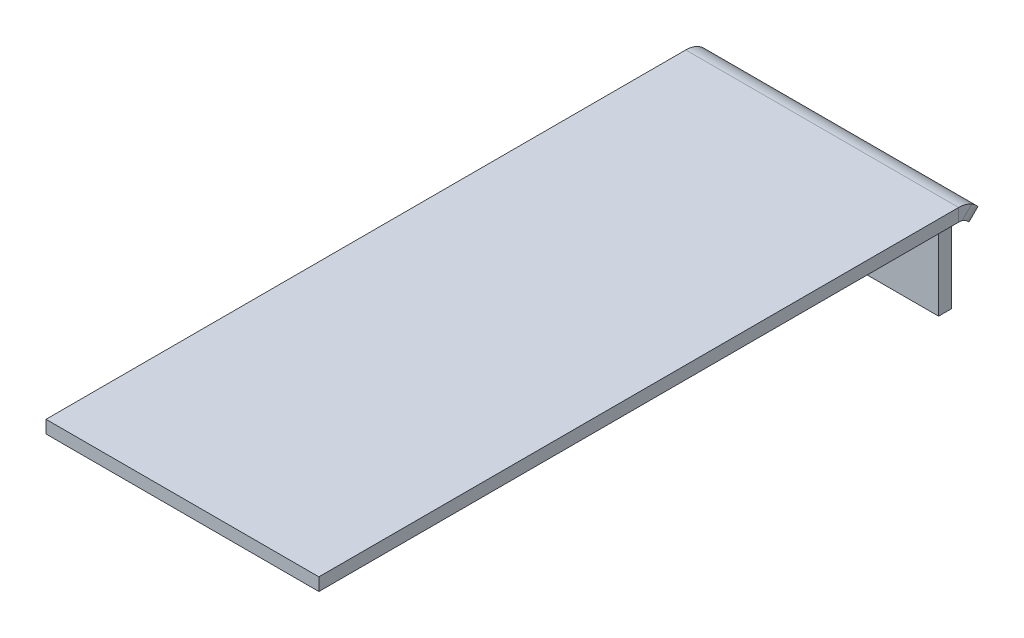
ISO-10303-21;
HEADER;
FILE_DESCRIPTION(('STEP AP214'),'2;1');
FILE_NAME('part.step','',(''),(''),'','','');
FILE_SCHEMA(('AUTOMOTIVE_DESIGN { 1 0 10303 214 1 1 1 1 }'));
ENDSEC;
DATA;
#1=APPLICATION_CONTEXT('core data for automotive mechanical design processes');
#2=APPLICATION_PROTOCOL_DEFINITION('international standard','automotive_design',2000,#1);
#3=PRODUCT_CONTEXT('',#1,'mechanical');
#4=PRODUCT('Part','Part','',(#3));
#5=PRODUCT_RELATED_PRODUCT_CATEGORY('part','',(#4));
#6=PRODUCT_DEFINITION_FORMATION('','',#4);
#7=PRODUCT_DEFINITION_CONTEXT('part definition',#1,'design');
#8=PRODUCT_DEFINITION('design','',#6,#7);
#9=PRODUCT_DEFINITION_SHAPE('','',#8);
#10=(LENGTH_UNIT() NAMED_UNIT(*) SI_UNIT(.MILLI.,.METRE.));
#11=(NAMED_UNIT(*) PLANE_ANGLE_UNIT() SI_UNIT($,.RADIAN.));
#12=(NAMED_UNIT(*) SI_UNIT($,.STERADIAN.) SOLID_ANGLE_UNIT());
#13=UNCERTAINTY_MEASURE_WITH_UNIT(LENGTH_MEASURE(1.E-05),#10,'distance_accuracy_value','');
#14=(GEOMETRIC_REPRESENTATION_CONTEXT(3) GLOBAL_UNCERTAINTY_ASSIGNED_CONTEXT((#13)) GLOBAL_UNIT_ASSIGNED_CONTEXT((#10,
#11,#12)) REPRESENTATION_CONTEXT('',''));
#15=CARTESIAN_POINT('',(0.,0.,0.));
#16=DIRECTION('',(0.,0.,1.));
#17=DIRECTION('',(1.,0.,0.));
#18=AXIS2_PLACEMENT_3D('',#15,#16,#17);
#19=CARTESIAN_POINT('',(53.5,-40.,-35.0000000000001));
#20=DIRECTION('',(0.,0.,-1.));
#21=DIRECTION('',(0.,1.,0.));
#22=AXIS2_PLACEMENT_3D('',#19,#20,#21);
#23=PLANE('',#22);
#24=DIRECTION('',(0.,-1.,0.));
#25=VECTOR('',#24,1.);
#26=CARTESIAN_POINT('',(-53.5,-40.,-35.0000000000001));
#27=LINE('',#26,#25);
#28=CARTESIAN_POINT('',(-53.5,-44.1421356237309,-35.0000000000001));
#29=VERTEX_POINT('',#28);
#30=CARTESIAN_POINT('',(-53.5,-72.,-35.0000000000001));
#31=VERTEX_POINT('',#30);
#32=EDGE_CURVE('E362',#29,#31,#27,.T.);
#33=ORIENTED_EDGE('',*,*,#32,.T.);
#34=DIRECTION('',(0.707106781186549,-0.707106781186546,0.));
#35=VECTOR('',#34,1.);
#36=CARTESIAN_POINT('',(-53.5,-72.,-35.0000000000001));
#37=LINE('',#36,#35);
#38=CARTESIAN_POINT('',(-45.4999999999999,-80.,-35.0000000000001));
#39=VERTEX_POINT('',#38);
#40=EDGE_CURVE('E60',#31,#39,#37,.T.);
#41=ORIENTED_EDGE('',*,*,#40,.T.);
#42=DIRECTION('',(-1.,0.,0.));
#43=VECTOR('',#42,1.);
#44=CARTESIAN_POINT('',(53.5,-80.,-35.0000000000001));
#45=LINE('',#44,#43);
#46=CARTESIAN_POINT('',(6.5,-80.,-35.0000000000001));
#47=VERTEX_POINT('',#46);
#48=EDGE_CURVE('E181',#47,#39,#45,.T.);
#49=ORIENTED_EDGE('',*,*,#48,.F.);
#50=DIRECTION('',(0.,1.,0.));
#51=VECTOR('',#50,1.);
#52=CARTESIAN_POINT('',(6.5,-40.,-35.0000000000001));
#53=LINE('',#52,#51);
#54=CARTESIAN_POINT('',(6.5,-44.142135623731,-35.0000000000001));
#55=VERTEX_POINT('',#54);
#56=EDGE_CURVE('E164',#47,#55,#53,.T.);
#57=ORIENTED_EDGE('',*,*,#56,.T.);
#58=DIRECTION('',(-1.,0.,0.));
#59=VECTOR('',#58,1.);
#60=CARTESIAN_POINT('',(53.5,-44.1421356237309,-35.0000000000001));
#61=LINE('',#60,#59);
#62=EDGE_CURVE('E305',#55,#29,#61,.T.);
#63=ORIENTED_EDGE('',*,*,#62,.T.);
#64=EDGE_LOOP('',(#33,#41,#49,#57,#63));
#65=FACE_BOUND('',#64,.T.);
#66=ADVANCED_FACE('F38',(#65),#23,.F.);
#67=CARTESIAN_POINT('',(53.5,-80.,-40.));
#68=DIRECTION('',(0.,-1.,0.));
#69=DIRECTION('',(0.,0.,-1.));
#70=AXIS2_PLACEMENT_3D('',#67,#68,#69);
#71=PLANE('',#70);
#72=ORIENTED_EDGE('',*,*,#48,.T.);
#73=DIRECTION('',(0.,0.,-1.));
#74=VECTOR('',#73,1.);
#75=CARTESIAN_POINT('',(-45.4999999999999,-80.,-40.));
#76=LINE('',#75,#74);
#77=CARTESIAN_POINT('',(-45.4999999999999,-80.,-40.));
#78=VERTEX_POINT('',#77);
#79=EDGE_CURVE('E46',#39,#78,#76,.T.);
#80=ORIENTED_EDGE('',*,*,#79,.T.);
#81=DIRECTION('',(-1.,0.,0.));
#82=VECTOR('',#81,1.);
#83=CARTESIAN_POINT('',(53.5,-80.,-40.));
#84=LINE('',#83,#82);
#85=CARTESIAN_POINT('',(6.5,-80.,-40.));
#86=VERTEX_POINT('',#85);
#87=EDGE_CURVE('E179',#86,#78,#84,.T.);
#88=ORIENTED_EDGE('',*,*,#87,.F.);
#89=DIRECTION('',(0.,0.,-1.));
#90=VECTOR('',#89,1.);
#91=CARTESIAN_POINT('',(6.5,-80.,-40.));
#92=LINE('',#91,#90);
#93=EDGE_CURVE('E156',#86,#47,#92,.F.);
#94=ORIENTED_EDGE('',*,*,#93,.T.);
#95=EDGE_LOOP('',(#72,#80,#88,#94));
#96=FACE_BOUND('',#95,.T.);
#97=ADVANCED_FACE('F267',(#96),#71,.T.);
#98=CARTESIAN_POINT('',(53.5,-40.,-40.));
#99=DIRECTION('',(0.,0.,-1.));
#100=DIRECTION('',(0.,1.,0.));
#101=AXIS2_PLACEMENT_3D('',#98,#99,#100);
#102=PLANE('',#101);
#103=ORIENTED_EDGE('',*,*,#87,.T.);
#104=DIRECTION('',(-0.707106781186549,0.707106781186546,0.));
#105=VECTOR('',#104,1.);
#106=CARTESIAN_POINT('',(-15.9999999999998,-109.5,-40.));
#107=LINE('',#106,#105);
#108=CARTESIAN_POINT('',(-53.5,-72.,-40.));
#109=VERTEX_POINT('',#108);
#110=EDGE_CURVE('E11',#78,#109,#107,.T.);
#111=ORIENTED_EDGE('',*,*,#110,.T.);
#112=DIRECTION('',(0.,-1.,0.));
#113=VECTOR('',#112,1.);
#114=CARTESIAN_POINT('',(-53.5,-40.,-40.));
#115=LINE('',#114,#113);
#116=CARTESIAN_POINT('',(-53.5,-44.1421356237309,-40.));
#117=VERTEX_POINT('',#116);
#118=EDGE_CURVE('E177',#117,#109,#115,.T.);
#119=ORIENTED_EDGE('',*,*,#118,.F.);
#120=DIRECTION('',(-1.,0.,0.));
#121=VECTOR('',#120,1.);
#122=CARTESIAN_POINT('',(53.5,-44.1421356237309,-40.));
#123=LINE('',#122,#121);
#124=CARTESIAN_POINT('',(6.5,-44.142135623731,-40.));
#125=VERTEX_POINT('',#124);
#126=EDGE_CURVE('E169',#125,#117,#123,.T.);
#127=ORIENTED_EDGE('',*,*,#126,.F.);
#128=DIRECTION('',(0.,1.,0.));
#129=VECTOR('',#128,1.);
#130=CARTESIAN_POINT('',(6.5,-80.,-40.));
#131=LINE('',#130,#129);
#132=EDGE_CURVE('E159',#86,#125,#131,.T.);
#133=ORIENTED_EDGE('',*,*,#132,.F.);
#134=EDGE_LOOP('',(#103,#111,#119,#127,#133));
#135=FACE_BOUND('',#134,.T.);
#136=ADVANCED_FACE('F175',(#135),#102,.T.);
#137=CARTESIAN_POINT('',(53.5,-44.142135623731,-30.0000000000002));
#138=DIRECTION('',(-1.,0.,0.));
#139=DIRECTION('',(0.,0.,1.));
#140=AXIS2_PLACEMENT_3D('',#137,#138,#139);
#141=CYLINDRICAL_SURFACE('',#140,10.);
#142=DIRECTION('',(-1.,0.,0.));
#143=VECTOR('',#142,1.);
#144=CARTESIAN_POINT('',(53.5,-37.0710678118655,-37.0710678118655));
#145=LINE('',#144,#143);
#146=CARTESIAN_POINT('',(6.5,-37.0710678118655,-37.0710678118655));
#147=VERTEX_POINT('',#146);
#148=CARTESIAN_POINT('',(-53.5,-37.0710678118655,-37.0710678118655));
#149=VERTEX_POINT('',#148);
#150=EDGE_CURVE('E171',#147,#149,#145,.T.);
#151=ORIENTED_EDGE('',*,*,#150,.F.);
#152=CARTESIAN_POINT('',(6.5,-44.142135623731,-30.0000000000002));
#153=DIRECTION('',(-1.,0.,0.));
#154=DIRECTION('',(0.,0.,1.));
#155=AXIS2_PLACEMENT_3D('',#152,#153,#154);
#156=CIRCLE('',#155,10.);
#157=EDGE_CURVE('E149',#125,#147,#156,.F.);
#158=ORIENTED_EDGE('',*,*,#157,.F.);
#159=ORIENTED_EDGE('',*,*,#126,.T.);
#160=CARTESIAN_POINT('',(-53.5,-44.142135623731,-30.0000000000002));
#161=DIRECTION('',(1.,0.,0.));
#162=DIRECTION('',(0.,0.,-1.));
#163=AXIS2_PLACEMENT_3D('',#160,#161,#162);
#164=CIRCLE('',#163,10.);
#165=EDGE_CURVE('E359',#149,#117,#164,.F.);
#166=ORIENTED_EDGE('',*,*,#165,.F.);
#167=EDGE_LOOP('',(#151,#158,#159,#166));
#168=FACE_BOUND('',#167,.T.);
#169=ADVANCED_FACE('F167',(#168),#141,.T.);
#170=CARTESIAN_POINT('',(53.5,0.,0.));
#171=DIRECTION('',(0.,0.707106781186548,-0.707106781186547));
#172=DIRECTION('',(0.,0.707106781186547,0.707106781186548));
#173=AXIS2_PLACEMENT_3D('',#170,#171,#172);
#174=PLANE('',#173);
#175=DIRECTION('',(-1.,0.,0.));
#176=VECTOR('',#175,1.);
#177=CARTESIAN_POINT('',(53.5,-2.92893218813452,-2.9289321881345));
#178=LINE('',#177,#176);
#179=CARTESIAN_POINT('',(53.2000735899034,-2.92893218813452,-2.9289321881345));
#180=VERTEX_POINT('',#179);
#181=CARTESIAN_POINT('',(-53.5,-2.92893218813452,-2.9289321881345));
#182=VERTEX_POINT('',#181);
#183=EDGE_CURVE('E183',#180,#182,#178,.T.);
#184=ORIENTED_EDGE('',*,*,#183,.F.);
#185=CARTESIAN_POINT('',(43.5,-1.21012848345235,-1.2101284834527));
#186=DIRECTION('',(0.,0.707106781186548,-0.707106781186547));
#187=DIRECTION('',(0.,0.707106781186547,0.707106781186548));
#188=AXIS2_PLACEMENT_3D('',#185,#186,#187);
#189=CIRCLE('',#188,10.);
#190=CARTESIAN_POINT('',(46.4703454373142,-7.96205591134384,-7.96205591134402));
#191=VERTEX_POINT('',#190);
#192=EDGE_CURVE('E215',#180,#191,#189,.T.);
#193=ORIENTED_EDGE('',*,*,#192,.T.);
#194=CARTESIAN_POINT('',(64.2924180611995,-48.4736204786927,-48.4736204786929));
#195=DIRECTION('',(0.,0.707106781186548,-0.707106781186547));
#196=DIRECTION('',(0.,0.707106781186547,0.707106781186548));
#197=AXIS2_PLACEMENT_3D('',#194,#195,#196);
#198=CIRCLE('',#197,60.);
#199=EDGE_CURVE('E200',#191,#147,#198,.F.);
#200=ORIENTED_EDGE('',*,*,#199,.T.);
#201=ORIENTED_EDGE('',*,*,#150,.T.);
#202=DIRECTION('',(0.,-0.707106781186547,-0.707106781186548));
#203=VECTOR('',#202,1.);
#204=CARTESIAN_POINT('',(-53.5,0.,0.));
#205=LINE('',#204,#203);
#206=EDGE_CURVE('E321',#182,#149,#205,.T.);
#207=ORIENTED_EDGE('',*,*,#206,.F.);
#208=EDGE_LOOP('',(#184,#193,#200,#201,#207));
#209=FACE_BOUND('',#208,.T.);
#210=ADVANCED_FACE('F318',(#209),#174,.T.);
#211=CARTESIAN_POINT('',(53.5,-3.53553390593274,3.53553390593309));
#212=DIRECTION('',(0.,0.707106781186548,-0.707106781186547));
#213=DIRECTION('',(0.,0.707106781186547,0.707106781186548));
#214=AXIS2_PLACEMENT_3D('',#211,#212,#213);
#215=PLANE('',#214);
#216=CARTESIAN_POINT('',(64.2924180611995,-52.0091543846255,-44.9380865727598));
#217=DIRECTION('',(0.,0.707106781186548,-0.707106781186547));
#218=DIRECTION('',(0.,0.707106781186547,0.707106781186548));
#219=AXIS2_PLACEMENT_3D('',#216,#217,#218);
#220=CIRCLE('',#219,60.);
#221=CARTESIAN_POINT('',(6.5,-40.6066017177982,-33.5355339059324));
#222=VERTEX_POINT('',#221);
#223=CARTESIAN_POINT('',(46.4703454373142,-11.4975898172766,-4.42652200541094));
#224=VERTEX_POINT('',#223);
#225=EDGE_CURVE('E202',#222,#224,#220,.T.);
#226=ORIENTED_EDGE('',*,*,#225,.T.);
#227=CARTESIAN_POINT('',(43.5,-4.74566238938509,2.32540542248039));
#228=DIRECTION('',(0.,0.707106781186548,-0.707106781186547));
#229=DIRECTION('',(0.,0.707106781186547,0.707106781186548));
#230=AXIS2_PLACEMENT_3D('',#227,#228,#229);
#231=CIRCLE('',#230,10.);
#232=CARTESIAN_POINT('',(53.2000735899034,-6.46446609406726,0.606601717798583));
#233=VERTEX_POINT('',#232);
#234=EDGE_CURVE('E239',#224,#233,#231,.F.);
#235=ORIENTED_EDGE('',*,*,#234,.T.);
#236=DIRECTION('',(-1.,0.,0.));
#237=VECTOR('',#236,1.);
#238=CARTESIAN_POINT('',(53.5,-6.46446609406726,0.606601717798583));
#239=LINE('',#238,#237);
#240=CARTESIAN_POINT('',(-53.5,-6.46446609406726,0.606601717798583));
#241=VERTEX_POINT('',#240);
#242=EDGE_CURVE('E333',#233,#241,#239,.T.);
#243=ORIENTED_EDGE('',*,*,#242,.T.);
#244=DIRECTION('',(0.,-0.707106781186547,-0.707106781186548));
#245=VECTOR('',#244,1.);
#246=CARTESIAN_POINT('',(-53.5,-3.53553390593274,3.53553390593309));
#247=LINE('',#246,#245);
#248=CARTESIAN_POINT('',(-53.5,-40.6066017177982,-33.5355339059324));
#249=VERTEX_POINT('',#248);
#250=EDGE_CURVE('E341',#241,#249,#247,.T.);
#251=ORIENTED_EDGE('',*,*,#250,.T.);
#252=DIRECTION('',(-1.,0.,0.));
#253=VECTOR('',#252,1.);
#254=CARTESIAN_POINT('',(53.5,-40.6066017177982,-33.5355339059324));
#255=LINE('',#254,#253);
#256=EDGE_CURVE('E335',#222,#249,#255,.T.);
#257=ORIENTED_EDGE('',*,*,#256,.F.);
#258=EDGE_LOOP('',(#226,#235,#243,#251,#257));
#259=FACE_BOUND('',#258,.T.);
#260=ADVANCED_FACE('F249',(#259),#215,.F.);
#261=CARTESIAN_POINT('',(53.5,-44.142135623731,-30.0000000000002));
#262=DIRECTION('',(-1.,0.,0.));
#263=DIRECTION('',(0.,0.,1.));
#264=AXIS2_PLACEMENT_3D('',#261,#262,#263);
#265=CYLINDRICAL_SURFACE('',#264,5.);
#266=CARTESIAN_POINT('',(6.5,-44.142135623731,-30.0000000000002));
#267=DIRECTION('',(-1.,0.,0.));
#268=DIRECTION('',(0.,0.,1.));
#269=AXIS2_PLACEMENT_3D('',#266,#267,#268);
#270=CIRCLE('',#269,5.);
#271=EDGE_CURVE('E152',#55,#222,#270,.F.);
#272=ORIENTED_EDGE('',*,*,#271,.T.);
#273=ORIENTED_EDGE('',*,*,#256,.T.);
#274=CARTESIAN_POINT('',(-53.5,-44.142135623731,-30.0000000000002));
#275=DIRECTION('',(1.,0.,0.));
#276=DIRECTION('',(0.,0.,-1.));
#277=AXIS2_PLACEMENT_3D('',#274,#275,#276);
#278=CIRCLE('',#277,5.);
#279=EDGE_CURVE('E338',#249,#29,#278,.F.);
#280=ORIENTED_EDGE('',*,*,#279,.T.);
#281=ORIENTED_EDGE('',*,*,#62,.F.);
#282=EDGE_LOOP('',(#272,#273,#280,#281));
#283=FACE_BOUND('',#282,.T.);
#284=ADVANCED_FACE('F291',(#283),#265,.F.);
#285=CARTESIAN_POINT('',(53.5,-2.92893218813452,-2.9289321881345));
#286=DIRECTION('',(1.,0.,0.));
#287=DIRECTION('',(0.,0.,-1.));
#288=AXIS2_PLACEMENT_3D('',#285,#286,#287);
#289=PLANE('',#288);
#290=CARTESIAN_POINT('',(53.5,-10.,4.14213562373078));
#291=DIRECTION('',(1.,0.,0.));
#292=DIRECTION('',(0.,0.,-1.));
#293=AXIS2_PLACEMENT_3D('',#290,#291,#292);
#294=CIRCLE('',#293,5.);
#295=CARTESIAN_POINT('',(53.5,-5.,4.14213562373078));
#296=VERTEX_POINT('',#295);
#297=CARTESIAN_POINT('',(53.5,-5.19158243194091,2.77132546503633));
#298=VERTEX_POINT('',#297);
#299=EDGE_CURVE('E299',#296,#298,#294,.F.);
#300=ORIENTED_EDGE('',*,*,#299,.T.);
#301=DIRECTION('',(0.,-0.707106781186548,0.707106781186547));
#302=VECTOR('',#301,1.);
#303=CARTESIAN_POINT('',(53.5,-1.21012848345235,-1.2101284834527));
#304=LINE('',#303,#302);
#305=CARTESIAN_POINT('',(53.5,-1.42220848188859,-0.998048485016056));
#306=VERTEX_POINT('',#305);
#307=EDGE_CURVE('E205',#298,#306,#304,.F.);
#308=ORIENTED_EDGE('',*,*,#307,.T.);
#309=CARTESIAN_POINT('',(53.5,-10.,4.14213562373078));
#310=DIRECTION('',(1.,0.,0.));
#311=DIRECTION('',(0.,0.,-1.));
#312=AXIS2_PLACEMENT_3D('',#309,#310,#311);
#313=CIRCLE('',#312,10.);
#314=CARTESIAN_POINT('',(53.5,0.,4.14213562373078));
#315=VERTEX_POINT('',#314);
#316=EDGE_CURVE('E315',#315,#306,#313,.F.);
#317=ORIENTED_EDGE('',*,*,#316,.F.);
#318=DIRECTION('',(0.,1.,0.));
#319=VECTOR('',#318,1.);
#320=CARTESIAN_POINT('',(53.5,-5.,4.14213562373078));
#321=LINE('',#320,#319);
#322=EDGE_CURVE('E198',#296,#315,#321,.T.);
#323=ORIENTED_EDGE('',*,*,#322,.F.);
#324=EDGE_LOOP('',(#300,#308,#317,#323));
#325=FACE_BOUND('',#324,.T.);
#326=ADVANCED_FACE('F288',(#325),#289,.T.);
#327=CARTESIAN_POINT('',(-53.5,0.,4.14213562373078));
#328=DIRECTION('',(-1.,0.,0.));
#329=DIRECTION('',(0.,0.,1.));
#330=AXIS2_PLACEMENT_3D('',#327,#328,#329);
#331=PLANE('',#330);
#332=DIRECTION('',(0.,-1.,0.));
#333=VECTOR('',#332,1.);
#334=CARTESIAN_POINT('',(-53.5,0.,4.14213562373078));
#335=LINE('',#334,#333);
#336=CARTESIAN_POINT('',(-53.5,0.,4.14213562373078));
#337=VERTEX_POINT('',#336);
#338=CARTESIAN_POINT('',(-53.5,-5.,4.14213562373078));
#339=VERTEX_POINT('',#338);
#340=EDGE_CURVE('E196',#337,#339,#335,.T.);
#341=ORIENTED_EDGE('',*,*,#340,.F.);
#342=CARTESIAN_POINT('',(-53.5,-10.,4.14213562373078));
#343=DIRECTION('',(1.,0.,0.));
#344=DIRECTION('',(0.,0.,-1.));
#345=AXIS2_PLACEMENT_3D('',#342,#343,#344);
#346=CIRCLE('',#345,10.);
#347=EDGE_CURVE('E356',#337,#182,#346,.F.);
#348=ORIENTED_EDGE('',*,*,#347,.T.);
#349=DIRECTION('',(0.,0.707106781186548,-0.707106781186547));
#350=VECTOR('',#349,1.);
#351=CARTESIAN_POINT('',(-53.5,-6.46446609406726,0.606601717798583));
#352=LINE('',#351,#350);
#353=EDGE_CURVE('E193',#241,#182,#352,.T.);
#354=ORIENTED_EDGE('',*,*,#353,.F.);
#355=CARTESIAN_POINT('',(-53.5,-10.,4.14213562373078));
#356=DIRECTION('',(1.,0.,0.));
#357=DIRECTION('',(0.,0.,-1.));
#358=AXIS2_PLACEMENT_3D('',#355,#356,#357);
#359=CIRCLE('',#358,5.);
#360=EDGE_CURVE('E344',#339,#241,#359,.F.);
#361=ORIENTED_EDGE('',*,*,#360,.F.);
#362=EDGE_LOOP('',(#341,#348,#354,#361));
#363=FACE_BOUND('',#362,.T.);
#364=ADVANCED_FACE('F285',(#363),#331,.T.);
#365=CARTESIAN_POINT('',(-53.5,-6.46446609406726,0.606601717798583));
#366=DIRECTION('',(-1.,0.,0.));
#367=DIRECTION('',(0.,0.,1.));
#368=AXIS2_PLACEMENT_3D('',#365,#366,#367);
#369=PLANE('',#368);
#370=DIRECTION('',(0.,0.,-1.));
#371=VECTOR('',#370,1.);
#372=CARTESIAN_POINT('',(-53.5,0.,0.));
#373=LINE('',#372,#371);
#374=CARTESIAN_POINT('',(-53.5,0.,255.));
#375=VERTEX_POINT('',#374);
#376=EDGE_CURVE('E353',#375,#337,#373,.T.);
#377=ORIENTED_EDGE('',*,*,#376,.T.);
#378=ORIENTED_EDGE('',*,*,#340,.T.);
#379=DIRECTION('',(0.,0.,-1.));
#380=VECTOR('',#379,1.);
#381=CARTESIAN_POINT('',(-53.5,-5.,0.));
#382=LINE('',#381,#380);
#383=CARTESIAN_POINT('',(-53.5,-5.00000000000003,255.));
#384=VERTEX_POINT('',#383);
#385=EDGE_CURVE('E347',#384,#339,#382,.T.);
#386=ORIENTED_EDGE('',*,*,#385,.F.);
#387=DIRECTION('',(0.,1.,0.));
#388=VECTOR('',#387,1.);
#389=CARTESIAN_POINT('',(-53.5,-5.00000000000003,255.));
#390=LINE('',#389,#388);
#391=EDGE_CURVE('E350',#384,#375,#390,.T.);
#392=ORIENTED_EDGE('',*,*,#391,.T.);
#393=EDGE_LOOP('',(#377,#378,#386,#392));
#394=FACE_BOUND('',#393,.T.);
#395=ADVANCED_FACE('F281',(#394),#369,.T.);
#396=CARTESIAN_POINT('',(-53.5,-37.0710678118655,-37.0710678118655));
#397=DIRECTION('',(-1.,0.,0.));
#398=DIRECTION('',(0.,0.,1.));
#399=AXIS2_PLACEMENT_3D('',#396,#397,#398);
#400=PLANE('',#399);
#401=DIRECTION('',(0.,-0.707106781186547,0.707106781186548));
#402=VECTOR('',#401,1.);
#403=CARTESIAN_POINT('',(-53.5,-37.0710678118655,-37.0710678118655));
#404=LINE('',#403,#402);
#405=EDGE_CURVE('E190',#149,#249,#404,.T.);
#406=ORIENTED_EDGE('',*,*,#405,.F.);
#407=ORIENTED_EDGE('',*,*,#165,.T.);
#408=DIRECTION('',(0.,0.,-1.));
#409=VECTOR('',#408,1.);
#410=CARTESIAN_POINT('',(-53.5,-44.1421356237309,-35.0000000000001));
#411=LINE('',#410,#409);
#412=EDGE_CURVE('E188',#29,#117,#411,.T.);
#413=ORIENTED_EDGE('',*,*,#412,.F.);
#414=ORIENTED_EDGE('',*,*,#279,.F.);
#415=EDGE_LOOP('',(#406,#407,#413,#414));
#416=FACE_BOUND('',#415,.T.);
#417=ADVANCED_FACE('F277',(#416),#400,.T.);
#418=CARTESIAN_POINT('',(-53.5,-44.1421356237309,-35.0000000000001));
#419=DIRECTION('',(-1.,0.,0.));
#420=DIRECTION('',(0.,0.,1.));
#421=AXIS2_PLACEMENT_3D('',#418,#419,#420);
#422=PLANE('',#421);
#423=ORIENTED_EDGE('',*,*,#206,.T.);
#424=ORIENTED_EDGE('',*,*,#405,.T.);
#425=ORIENTED_EDGE('',*,*,#250,.F.);
#426=ORIENTED_EDGE('',*,*,#353,.T.);
#427=EDGE_LOOP('',(#423,#424,#425,#426));
#428=FACE_BOUND('',#427,.T.);
#429=ADVANCED_FACE('F263',(#428),#422,.T.);
#430=CARTESIAN_POINT('',(53.5,-10.,4.14213562373078));
#431=DIRECTION('',(-1.,0.,0.));
#432=DIRECTION('',(0.,0.,1.));
#433=AXIS2_PLACEMENT_3D('',#430,#431,#432);
#434=CYLINDRICAL_SURFACE('',#433,10.);
#435=ORIENTED_EDGE('',*,*,#316,.T.);
#436=CARTESIAN_POINT('',(53.5,-1.42220848188859,-0.998048485016056));
#437=CARTESIAN_POINT('',(53.5000401288917,-1.52879233276821,-1.17599267234024));
#438=CARTESIAN_POINT('',(53.4939279943103,-1.64099012015214,-1.3505899688412));
#439=CARTESIAN_POINT('',(53.4692150601139,-1.87466620033389,-1.69061532621218));
#440=CARTESIAN_POINT('',(53.4507077387778,-1.99606904035794,-1.8561020587085));
#441=CARTESIAN_POINT('',(53.4010283981334,-2.24783001422379,-2.17812022988339));
#442=CARTESIAN_POINT('',(53.3698563788252,-2.3781881480656,-2.33465166856196));
#443=CARTESIAN_POINT('',(53.2946560837504,-2.64756418348869,-2.6389770706916));
#444=CARTESIAN_POINT('',(53.2505329677111,-2.78663979362114,-2.78669654444406));
#445=CARTESIAN_POINT('',(53.2000735899034,-2.92893218813452,-2.9289321881345));
#446=B_SPLINE_CURVE_WITH_KNOTS('',3,(#436,#437,#438,#439,#440,#441,#442,#443,#444,#445),
.UNSPECIFIED.,.F.,.F.,(4,2,2,2,4),(0.,0.622096384709877,1.23955328103539,1.8570101773609,
2.47910656207079),.UNSPECIFIED.);
#447=EDGE_CURVE('E208',#306,#180,#446,.T.);
#448=ORIENTED_EDGE('',*,*,#447,.T.);
#449=ORIENTED_EDGE('',*,*,#183,.T.);
#450=ORIENTED_EDGE('',*,*,#347,.F.);
#451=DIRECTION('',(-1.,0.,0.));
#452=VECTOR('',#451,1.);
#453=CARTESIAN_POINT('',(53.5,0.,4.14213562373078));
#454=LINE('',#453,#452);
#455=EDGE_CURVE('E323',#315,#337,#454,.T.);
#456=ORIENTED_EDGE('',*,*,#455,.F.);
#457=EDGE_LOOP('',(#435,#448,#449,#450,#456));
#458=FACE_BOUND('',#457,.T.);
#459=ADVANCED_FACE('F217',(#458),#434,.T.);
#460=CARTESIAN_POINT('',(53.5,0.,0.));
#461=DIRECTION('',(0.,1.,0.));
#462=DIRECTION('',(0.,0.,1.));
#463=AXIS2_PLACEMENT_3D('',#460,#461,#462);
#464=PLANE('',#463);
#465=ORIENTED_EDGE('',*,*,#376,.F.);
#466=DIRECTION('',(-1.,0.,0.));
#467=VECTOR('',#466,1.);
#468=CARTESIAN_POINT('',(53.5,0.,255.));
#469=LINE('',#468,#467);
#470=CARTESIAN_POINT('',(53.5,0.,255.));
#471=VERTEX_POINT('',#470);
#472=EDGE_CURVE('E325',#471,#375,#469,.T.);
#473=ORIENTED_EDGE('',*,*,#472,.F.);
#474=DIRECTION('',(0.,0.,-1.));
#475=VECTOR('',#474,1.);
#476=CARTESIAN_POINT('',(53.5,0.,0.));
#477=LINE('',#476,#475);
#478=EDGE_CURVE('E368',#471,#315,#477,.T.);
#479=ORIENTED_EDGE('',*,*,#478,.T.);
#480=ORIENTED_EDGE('',*,*,#455,.T.);
#481=EDGE_LOOP('',(#465,#473,#479,#480));
#482=FACE_BOUND('',#481,.T.);
#483=ADVANCED_FACE('F256',(#482),#464,.T.);
#484=CARTESIAN_POINT('',(53.5,-5.00000000000003,255.));
#485=DIRECTION('',(0.,0.,1.));
#486=DIRECTION('',(1.,0.,0.));
#487=AXIS2_PLACEMENT_3D('',#484,#485,#486);
#488=PLANE('',#487);
#489=ORIENTED_EDGE('',*,*,#391,.F.);
#490=DIRECTION('',(-1.,0.,0.));
#491=VECTOR('',#490,1.);
#492=CARTESIAN_POINT('',(53.5,-5.00000000000003,255.));
#493=LINE('',#492,#491);
#494=CARTESIAN_POINT('',(53.5,-5.00000000000003,255.));
#495=VERTEX_POINT('',#494);
#496=EDGE_CURVE('E329',#495,#384,#493,.T.);
#497=ORIENTED_EDGE('',*,*,#496,.F.);
#498=DIRECTION('',(0.,1.,0.));
#499=VECTOR('',#498,1.);
#500=CARTESIAN_POINT('',(53.5,-5.00000000000003,255.));
#501=LINE('',#500,#499);
#502=EDGE_CURVE('E365',#495,#471,#501,.T.);
#503=ORIENTED_EDGE('',*,*,#502,.T.);
#504=ORIENTED_EDGE('',*,*,#472,.T.);
#505=EDGE_LOOP('',(#489,#497,#503,#504));
#506=FACE_BOUND('',#505,.T.);
#507=ADVANCED_FACE('F253',(#506),#488,.T.);
#508=CARTESIAN_POINT('',(53.5,-5.,0.));
#509=DIRECTION('',(0.,1.,0.));
#510=DIRECTION('',(0.,0.,1.));
#511=AXIS2_PLACEMENT_3D('',#508,#509,#510);
#512=PLANE('',#511);
#513=ORIENTED_EDGE('',*,*,#385,.T.);
#514=DIRECTION('',(-1.,0.,0.));
#515=VECTOR('',#514,1.);
#516=CARTESIAN_POINT('',(53.5,-5.,4.14213562373078));
#517=LINE('',#516,#515);
#518=EDGE_CURVE('E331',#296,#339,#517,.T.);
#519=ORIENTED_EDGE('',*,*,#518,.F.);
#520=DIRECTION('',(0.,0.,-1.));
#521=VECTOR('',#520,1.);
#522=CARTESIAN_POINT('',(53.5,-5.,0.));
#523=LINE('',#522,#521);
#524=EDGE_CURVE('E306',#495,#296,#523,.T.);
#525=ORIENTED_EDGE('',*,*,#524,.F.);
#526=ORIENTED_EDGE('',*,*,#496,.T.);
#527=EDGE_LOOP('',(#513,#519,#525,#526));
#528=FACE_BOUND('',#527,.T.);
#529=ADVANCED_FACE('F247',(#528),#512,.F.);
#530=CARTESIAN_POINT('',(53.5,-10.,4.14213562373078));
#531=DIRECTION('',(-1.,0.,0.));
#532=DIRECTION('',(0.,0.,1.));
#533=AXIS2_PLACEMENT_3D('',#530,#531,#532);
#534=CYLINDRICAL_SURFACE('',#533,5.);
#535=ORIENTED_EDGE('',*,*,#242,.F.);
#536=CARTESIAN_POINT('',(53.2000735899034,-6.46446609406726,0.606601717798583));
#537=CARTESIAN_POINT('',(53.2317526768921,-6.37512634735612,0.695912215986583));
#538=CARTESIAN_POINT('',(53.2609240521461,-6.28874713862442,0.789090627113658));
#539=CARTESIAN_POINT('',(53.3141814329088,-6.12266552407316,0.982627956675707));
#540=CARTESIAN_POINT('',(53.3382658701969,-6.04296518179471,1.08298907669444));
#541=CARTESIAN_POINT('',(53.3807604385295,-5.8928175061785,1.28787303498389));
#542=CARTESIAN_POINT('',(53.3992893900884,-5.82219823055046,1.39224503230455));
#543=CARTESIAN_POINT('',(53.4314766509167,-5.68878560143943,1.60651729965571));
#544=CARTESIAN_POINT('',(53.4451367664967,-5.62598935129463,1.71641550219315));
#545=CARTESIAN_POINT('',(53.4714247249829,-5.48981009591306,1.97736179878048));
#546=CARTESIAN_POINT('',(53.4822967353928,-5.41955071333523,2.13024402241921));
#547=CARTESIAN_POINT('',(53.4930303472385,-5.3254463985381,2.36566047959018));
#548=CARTESIAN_POINT('',(53.4956773190095,-5.29577075415353,2.44580593816898));
#549=CARTESIAN_POINT('',(53.4991624024525,-5.24055664921205,2.60753649776435));
#550=CARTESIAN_POINT('',(53.5000007589224,-5.21501762919169,2.68912140244318));
#551=CARTESIAN_POINT('',(53.5,-5.19158243194091,2.77132546503633));
#552=B_SPLINE_CURVE_WITH_KNOTS('',3,(#536,#537,#538,#539,#540,#541,#542,#543,#544,#545,#546,
#547,#548,#549,#550,#551),.UNSPECIFIED.,.F.,.F.,(4,2,2,2,2,2,2,4),(0.,0.390612803117321,
0.781345850642114,1.16300190058106,1.5445162105625,2.04915363334294,2.30555542754155,
2.56192251531883),.UNSPECIFIED.);
#553=EDGE_CURVE('E230',#233,#298,#552,.T.);
#554=ORIENTED_EDGE('',*,*,#553,.T.);
#555=ORIENTED_EDGE('',*,*,#299,.F.);
#556=ORIENTED_EDGE('',*,*,#518,.T.);
#557=ORIENTED_EDGE('',*,*,#360,.T.);
#558=EDGE_LOOP('',(#535,#554,#555,#556,#557));
#559=FACE_BOUND('',#558,.T.);
#560=ADVANCED_FACE('F241',(#559),#534,.F.);
#561=CARTESIAN_POINT('',(53.5,-44.142135623731,-30.0000000000002));
#562=DIRECTION('',(1.,0.,0.));
#563=DIRECTION('',(0.,0.,-1.));
#564=AXIS2_PLACEMENT_3D('',#561,#562,#563);
#565=PLANE('',#564);
#566=ORIENTED_EDGE('',*,*,#524,.T.);
#567=ORIENTED_EDGE('',*,*,#322,.T.);
#568=ORIENTED_EDGE('',*,*,#478,.F.);
#569=ORIENTED_EDGE('',*,*,#502,.F.);
#570=EDGE_LOOP('',(#566,#567,#568,#569));
#571=FACE_BOUND('',#570,.T.);
#572=ADVANCED_FACE('F246',(#571),#565,.T.);
#573=CARTESIAN_POINT('',(-53.5,-44.142135623731,-30.0000000000002));
#574=DIRECTION('',(1.,0.,0.));
#575=DIRECTION('',(0.,0.,-1.));
#576=AXIS2_PLACEMENT_3D('',#573,#574,#575);
#577=PLANE('',#576);
#578=ORIENTED_EDGE('',*,*,#118,.T.);
#579=DIRECTION('',(0.,0.,1.));
#580=VECTOR('',#579,1.);
#581=CARTESIAN_POINT('',(-53.5,-72.,-35.0000000000001));
#582=LINE('',#581,#580);
#583=EDGE_CURVE('E238',#109,#31,#582,.T.);
#584=ORIENTED_EDGE('',*,*,#583,.T.);
#585=ORIENTED_EDGE('',*,*,#32,.F.);
#586=ORIENTED_EDGE('',*,*,#412,.T.);
#587=EDGE_LOOP('',(#578,#584,#585,#586));
#588=FACE_BOUND('',#587,.T.);
#589=ADVANCED_FACE('F392',(#588),#577,.F.);
#590=CARTESIAN_POINT('',(6.5,-80.,-40.));
#591=DIRECTION('',(-1.,0.,0.));
#592=DIRECTION('',(0.,1.,0.));
#593=AXIS2_PLACEMENT_3D('',#590,#591,#592);
#594=PLANE('',#593);
#595=ORIENTED_EDGE('',*,*,#132,.T.);
#596=DIRECTION('',(0.,0.,-1.));
#597=VECTOR('',#596,1.);
#598=CARTESIAN_POINT('',(6.5,-44.142135623731,-40.));
#599=LINE('',#598,#597);
#600=EDGE_CURVE('E145',#125,#55,#599,.F.);
#601=ORIENTED_EDGE('',*,*,#600,.T.);
#602=ORIENTED_EDGE('',*,*,#56,.F.);
#603=ORIENTED_EDGE('',*,*,#93,.F.);
#604=EDGE_LOOP('',(#595,#601,#602,#603));
#605=FACE_BOUND('',#604,.T.);
#606=ADVANCED_FACE('F160',(#605),#594,.F.);
#607=CARTESIAN_POINT('',(6.5,-44.142135623731,-30.0000000000002));
#608=DIRECTION('',(1.,0.,0.));
#609=DIRECTION('',(0.,0.,-1.));
#610=AXIS2_PLACEMENT_3D('',#607,#608,#609);
#611=PLANE('',#610);
#612=ORIENTED_EDGE('',*,*,#157,.T.);
#613=DIRECTION('',(0.,0.707106781186548,-0.707106781186547));
#614=VECTOR('',#613,1.);
#615=CARTESIAN_POINT('',(6.5,-37.0710678118655,-37.0710678118655));
#616=LINE('',#615,#614);
#617=EDGE_CURVE('E155',#147,#222,#616,.F.);
#618=ORIENTED_EDGE('',*,*,#617,.T.);
#619=ORIENTED_EDGE('',*,*,#271,.F.);
#620=ORIENTED_EDGE('',*,*,#600,.F.);
#621=EDGE_LOOP('',(#612,#618,#619,#620));
#622=FACE_BOUND('',#621,.T.);
#623=ADVANCED_FACE('F147',(#622),#611,.T.);
#624=CARTESIAN_POINT('',(64.2924180611995,-48.4736204786927,-48.4736204786929));
#625=DIRECTION('',(0.,0.707106781186548,-0.707106781186547));
#626=DIRECTION('',(0.,0.707106781186547,0.707106781186548));
#627=AXIS2_PLACEMENT_3D('',#624,#625,#626);
#628=CYLINDRICAL_SURFACE('',#627,60.);
#629=ORIENTED_EDGE('',*,*,#199,.F.);
#630=DIRECTION('',(0.,0.707106781186548,-0.707106781186547));
#631=VECTOR('',#630,1.);
#632=CARTESIAN_POINT('',(46.4703454373142,-7.96205591134384,-7.96205591134402));
#633=LINE('',#632,#631);
#634=EDGE_CURVE('E382',#191,#224,#633,.F.);
#635=ORIENTED_EDGE('',*,*,#634,.T.);
#636=ORIENTED_EDGE('',*,*,#225,.F.);
#637=ORIENTED_EDGE('',*,*,#617,.F.);
#638=EDGE_LOOP('',(#629,#635,#636,#637));
#639=FACE_BOUND('',#638,.T.);
#640=ADVANCED_FACE('F225',(#639),#628,.F.);
#641=CARTESIAN_POINT('',(43.5,-1.21012848345235,-1.2101284834527));
#642=DIRECTION('',(0.,0.707106781186548,-0.707106781186547));
#643=DIRECTION('',(0.,0.707106781186547,0.707106781186548));
#644=AXIS2_PLACEMENT_3D('',#641,#642,#643);
#645=CYLINDRICAL_SURFACE('',#644,10.);
#646=ORIENTED_EDGE('',*,*,#234,.F.);
#647=ORIENTED_EDGE('',*,*,#634,.F.);
#648=ORIENTED_EDGE('',*,*,#192,.F.);
#649=ORIENTED_EDGE('',*,*,#447,.F.);
#650=ORIENTED_EDGE('',*,*,#307,.F.);
#651=ORIENTED_EDGE('',*,*,#553,.F.);
#652=EDGE_LOOP('',(#646,#647,#648,#649,#650,#651));
#653=FACE_BOUND('',#652,.T.);
#654=ADVANCED_FACE('F221',(#653),#645,.T.);
#655=CARTESIAN_POINT('',(-53.5,-72.,-30.0000000000002));
#656=DIRECTION('',(-0.707106781186546,-0.707106781186549,0.));
#657=DIRECTION('',(0.,0.,-1.));
#658=AXIS2_PLACEMENT_3D('',#655,#656,#657);
#659=PLANE('',#658);
#660=ORIENTED_EDGE('',*,*,#110,.F.);
#661=ORIENTED_EDGE('',*,*,#79,.F.);
#662=ORIENTED_EDGE('',*,*,#40,.F.);
#663=ORIENTED_EDGE('',*,*,#583,.F.);
#664=EDGE_LOOP('',(#660,#661,#662,#663));
#665=FACE_BOUND('',#664,.T.);
#666=ADVANCED_FACE('F40',(#665),#659,.T.);
#667=CLOSED_SHELL('',(#66,#97,#136,#169,#210,#260,#284,#326,#364,#395,#417,#429,#459,#483,#507,
#529,#560,#572,#589,#606,#623,#640,#654,#666));
#668=MANIFOLD_SOLID_BREP('B2',#667);
#669=ADVANCED_BREP_SHAPE_REPRESENTATION('',(#18,#668),#14);
#670=SHAPE_DEFINITION_REPRESENTATION(#9,#669);
ENDSEC;
END-ISO-10303-21;
